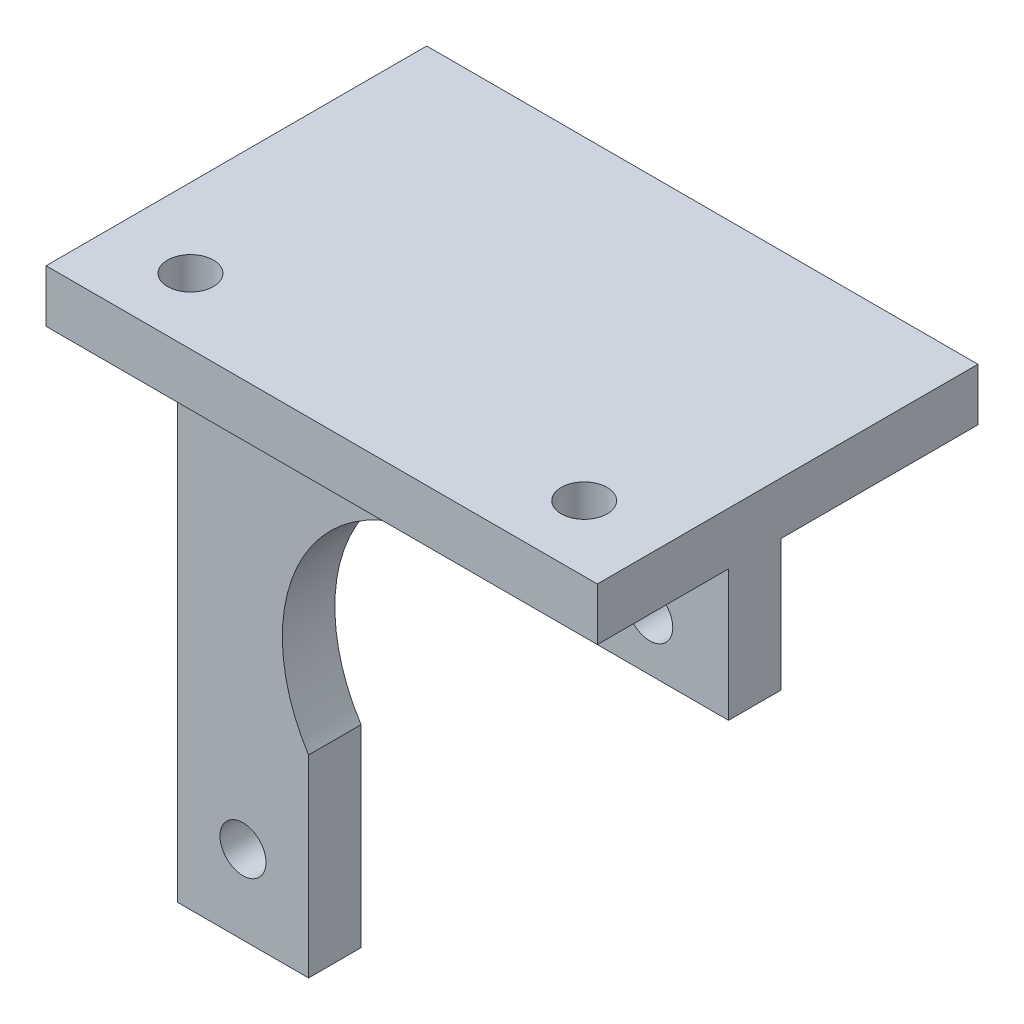
ISO-10303-21;
HEADER;
FILE_DESCRIPTION(('STEP AP214'),'2;1');
FILE_NAME('part.step','',(''),(''),'','','');
FILE_SCHEMA(('AUTOMOTIVE_DESIGN { 1 0 10303 214 1 1 1 1 }'));
ENDSEC;
DATA;
#1=APPLICATION_CONTEXT('core data for automotive mechanical design processes');
#2=APPLICATION_PROTOCOL_DEFINITION('international standard','automotive_design',2000,#1);
#3=PRODUCT_CONTEXT('',#1,'mechanical');
#4=PRODUCT('Part','Part','',(#3));
#5=PRODUCT_RELATED_PRODUCT_CATEGORY('part','',(#4));
#6=PRODUCT_DEFINITION_FORMATION('','',#4);
#7=PRODUCT_DEFINITION_CONTEXT('part definition',#1,'design');
#8=PRODUCT_DEFINITION('design','',#6,#7);
#9=PRODUCT_DEFINITION_SHAPE('','',#8);
#10=(LENGTH_UNIT() NAMED_UNIT(*) SI_UNIT(.MILLI.,.METRE.));
#11=(NAMED_UNIT(*) PLANE_ANGLE_UNIT() SI_UNIT($,.RADIAN.));
#12=(NAMED_UNIT(*) SI_UNIT($,.STERADIAN.) SOLID_ANGLE_UNIT());
#13=UNCERTAINTY_MEASURE_WITH_UNIT(LENGTH_MEASURE(1.E-05),#10,'distance_accuracy_value','');
#14=(GEOMETRIC_REPRESENTATION_CONTEXT(3) GLOBAL_UNCERTAINTY_ASSIGNED_CONTEXT((#13)) GLOBAL_UNIT_ASSIGNED_CONTEXT((#10,
#11,#12)) REPRESENTATION_CONTEXT('',''));
#15=CARTESIAN_POINT('',(0.,0.,0.));
#16=DIRECTION('',(0.,0.,1.));
#17=DIRECTION('',(1.,0.,0.));
#18=AXIS2_PLACEMENT_3D('',#15,#16,#17);
#19=CARTESIAN_POINT('',(0.,0.,4.));
#20=DIRECTION('',(0.,0.,1.));
#21=DIRECTION('',(1.,0.,0.));
#22=AXIS2_PLACEMENT_3D('',#19,#20,#21);
#23=PLANE('',#22);
#24=CARTESIAN_POINT('',(15.5,15.5,4.));
#25=DIRECTION('',(0.,0.,1.));
#26=DIRECTION('',(1.,0.,0.));
#27=AXIS2_PLACEMENT_3D('',#24,#25,#26);
#28=CIRCLE('',#27,1.75);
#29=CARTESIAN_POINT('',(17.25,15.5,4.));
#30=VERTEX_POINT('',#29);
#31=EDGE_CURVE('E198',#30,#30,#28,.T.);
#32=ORIENTED_EDGE('',*,*,#31,.F.);
#33=EDGE_LOOP('',(#32));
#34=FACE_BOUND('',#33,.T.);
#35=CARTESIAN_POINT('',(0.,0.,4.));
#36=DIRECTION('',(0.,0.,-1.));
#37=DIRECTION('',(1.,0.,0.));
#38=AXIS2_PLACEMENT_3D('',#35,#36,#37);
#39=CIRCLE('',#38,12.5);
#40=CARTESIAN_POINT('',(-10.5,-6.78232998312527,4.));
#41=VERTEX_POINT('',#40);
#42=CARTESIAN_POINT('',(4.89897948556636,11.5,4.));
#43=VERTEX_POINT('',#42);
#44=EDGE_CURVE('E134',#41,#43,#39,.T.);
#45=ORIENTED_EDGE('',*,*,#44,.T.);
#46=DIRECTION('',(1.,0.,0.));
#47=VECTOR('',#46,1.);
#48=CARTESIAN_POINT('',(21.5,11.5,4.));
#49=LINE('',#48,#47);
#50=CARTESIAN_POINT('',(21.5,11.5,4.));
#51=VERTEX_POINT('',#50);
#52=EDGE_CURVE('E85',#43,#51,#49,.T.);
#53=ORIENTED_EDGE('',*,*,#52,.T.);
#54=DIRECTION('',(0.,1.,0.));
#55=VECTOR('',#54,1.);
#56=CARTESIAN_POINT('',(21.5,21.5,4.));
#57=LINE('',#56,#55);
#58=CARTESIAN_POINT('',(21.5,21.5,3.99999999999999));
#59=VERTEX_POINT('',#58);
#60=EDGE_CURVE('E144',#51,#59,#57,.T.);
#61=ORIENTED_EDGE('',*,*,#60,.T.);
#62=DIRECTION('',(-1.,0.,0.));
#63=VECTOR('',#62,1.);
#64=CARTESIAN_POINT('',(-20.5,21.5,4.));
#65=LINE('',#64,#63);
#66=CARTESIAN_POINT('',(-20.5,21.5,4.));
#67=VERTEX_POINT('',#66);
#68=EDGE_CURVE('E102',#59,#67,#65,.T.);
#69=ORIENTED_EDGE('',*,*,#68,.T.);
#70=DIRECTION('',(0.,-1.,0.));
#71=VECTOR('',#70,1.);
#72=CARTESIAN_POINT('',(-20.5,-21.5,4.));
#73=LINE('',#72,#71);
#74=CARTESIAN_POINT('',(-20.5,-21.5,4.));
#75=VERTEX_POINT('',#74);
#76=EDGE_CURVE('E95',#67,#75,#73,.T.);
#77=ORIENTED_EDGE('',*,*,#76,.T.);
#78=DIRECTION('',(1.,0.,0.));
#79=VECTOR('',#78,1.);
#80=CARTESIAN_POINT('',(-10.5,-21.5,4.));
#81=LINE('',#80,#79);
#82=CARTESIAN_POINT('',(-10.5,-21.5,4.));
#83=VERTEX_POINT('',#82);
#84=EDGE_CURVE('E99',#75,#83,#81,.T.);
#85=ORIENTED_EDGE('',*,*,#84,.T.);
#86=DIRECTION('',(0.,1.,0.));
#87=VECTOR('',#86,1.);
#88=CARTESIAN_POINT('',(-10.5,-6.78232998312527,4.));
#89=LINE('',#88,#87);
#90=EDGE_CURVE('E50',#83,#41,#89,.T.);
#91=ORIENTED_EDGE('',*,*,#90,.T.);
#92=EDGE_LOOP('',(#45,#53,#61,#69,#77,#85,#91));
#93=FACE_BOUND('',#92,.T.);
#94=CARTESIAN_POINT('',(-15.5,15.5,4.));
#95=DIRECTION('',(0.,0.,1.));
#96=DIRECTION('',(1.,0.,0.));
#97=AXIS2_PLACEMENT_3D('',#94,#95,#96);
#98=CIRCLE('',#97,1.75);
#99=CARTESIAN_POINT('',(-13.75,15.5,4.));
#100=VERTEX_POINT('',#99);
#101=EDGE_CURVE('E123',#100,#100,#98,.T.);
#102=ORIENTED_EDGE('',*,*,#101,.F.);
#103=EDGE_LOOP('',(#102));
#104=FACE_BOUND('',#103,.T.);
#105=CARTESIAN_POINT('',(-15.5,-15.5,4.));
#106=DIRECTION('',(0.,0.,1.));
#107=DIRECTION('',(1.,0.,0.));
#108=AXIS2_PLACEMENT_3D('',#105,#106,#107);
#109=CIRCLE('',#108,1.75);
#110=CARTESIAN_POINT('',(-13.75,-15.5,4.));
#111=VERTEX_POINT('',#110);
#112=EDGE_CURVE('E192',#111,#111,#109,.T.);
#113=ORIENTED_EDGE('',*,*,#112,.F.);
#114=EDGE_LOOP('',(#113));
#115=FACE_BOUND('',#114,.T.);
#116=ADVANCED_FACE('F33',(#34,#93,#104,#115),#23,.T.);
#117=CARTESIAN_POINT('',(0.,0.,0.));
#118=DIRECTION('',(0.,0.,1.));
#119=DIRECTION('',(1.,0.,0.));
#120=AXIS2_PLACEMENT_3D('',#117,#118,#119);
#121=PLANE('',#120);
#122=CARTESIAN_POINT('',(0.,0.,0.));
#123=DIRECTION('',(0.,0.,-1.));
#124=DIRECTION('',(1.,0.,0.));
#125=AXIS2_PLACEMENT_3D('',#122,#123,#124);
#126=CIRCLE('',#125,12.5);
#127=CARTESIAN_POINT('',(-10.5,-6.78232998312527,0.));
#128=VERTEX_POINT('',#127);
#129=CARTESIAN_POINT('',(4.89897948556636,11.5,0.));
#130=VERTEX_POINT('',#129);
#131=EDGE_CURVE('E119',#128,#130,#126,.T.);
#132=ORIENTED_EDGE('',*,*,#131,.F.);
#133=DIRECTION('',(0.,1.,0.));
#134=VECTOR('',#133,1.);
#135=CARTESIAN_POINT('',(-10.5,-6.78232998312527,0.));
#136=LINE('',#135,#134);
#137=CARTESIAN_POINT('',(-10.5,-21.5,0.));
#138=VERTEX_POINT('',#137);
#139=EDGE_CURVE('E77',#138,#128,#136,.T.);
#140=ORIENTED_EDGE('',*,*,#139,.F.);
#141=DIRECTION('',(1.,0.,0.));
#142=VECTOR('',#141,1.);
#143=CARTESIAN_POINT('',(-10.5,-21.5,0.));
#144=LINE('',#143,#142);
#145=CARTESIAN_POINT('',(-20.5,-21.5,0.));
#146=VERTEX_POINT('',#145);
#147=EDGE_CURVE('E71',#146,#138,#144,.T.);
#148=ORIENTED_EDGE('',*,*,#147,.F.);
#149=DIRECTION('',(0.,-1.,0.));
#150=VECTOR('',#149,1.);
#151=CARTESIAN_POINT('',(-20.5,-21.5,0.));
#152=LINE('',#151,#150);
#153=CARTESIAN_POINT('',(-20.5,21.5,0.));
#154=VERTEX_POINT('',#153);
#155=EDGE_CURVE('E110',#154,#146,#152,.T.);
#156=ORIENTED_EDGE('',*,*,#155,.F.);
#157=DIRECTION('',(-1.,0.,0.));
#158=VECTOR('',#157,1.);
#159=CARTESIAN_POINT('',(-20.5,21.5,0.));
#160=LINE('',#159,#158);
#161=CARTESIAN_POINT('',(21.5,21.5,0.));
#162=VERTEX_POINT('',#161);
#163=EDGE_CURVE('E128',#162,#154,#160,.T.);
#164=ORIENTED_EDGE('',*,*,#163,.F.);
#165=DIRECTION('',(0.,1.,0.));
#166=VECTOR('',#165,1.);
#167=CARTESIAN_POINT('',(21.5,21.5,0.));
#168=LINE('',#167,#166);
#169=CARTESIAN_POINT('',(21.5,11.5,0.));
#170=VERTEX_POINT('',#169);
#171=EDGE_CURVE('E125',#170,#162,#168,.T.);
#172=ORIENTED_EDGE('',*,*,#171,.F.);
#173=DIRECTION('',(1.,0.,0.));
#174=VECTOR('',#173,1.);
#175=CARTESIAN_POINT('',(21.5,11.5,0.));
#176=LINE('',#175,#174);
#177=EDGE_CURVE('E122',#130,#170,#176,.T.);
#178=ORIENTED_EDGE('',*,*,#177,.F.);
#179=EDGE_LOOP('',(#132,#140,#148,#156,#164,#172,#178));
#180=FACE_BOUND('',#179,.T.);
#181=CARTESIAN_POINT('',(-15.5,15.5,0.));
#182=DIRECTION('',(0.,0.,1.));
#183=DIRECTION('',(1.,0.,0.));
#184=AXIS2_PLACEMENT_3D('',#181,#182,#183);
#185=CIRCLE('',#184,1.75);
#186=CARTESIAN_POINT('',(-13.75,15.5,0.));
#187=VERTEX_POINT('',#186);
#188=EDGE_CURVE('E201',#187,#187,#185,.T.);
#189=ORIENTED_EDGE('',*,*,#188,.T.);
#190=EDGE_LOOP('',(#189));
#191=FACE_BOUND('',#190,.T.);
#192=CARTESIAN_POINT('',(15.5,15.5,0.));
#193=DIRECTION('',(0.,0.,1.));
#194=DIRECTION('',(1.,0.,0.));
#195=AXIS2_PLACEMENT_3D('',#192,#193,#194);
#196=CIRCLE('',#195,1.75);
#197=CARTESIAN_POINT('',(17.25,15.5,0.));
#198=VERTEX_POINT('',#197);
#199=EDGE_CURVE('E195',#198,#198,#196,.T.);
#200=ORIENTED_EDGE('',*,*,#199,.T.);
#201=EDGE_LOOP('',(#200));
#202=FACE_BOUND('',#201,.T.);
#203=CARTESIAN_POINT('',(-15.5,-15.5,0.));
#204=DIRECTION('',(0.,0.,1.));
#205=DIRECTION('',(1.,0.,0.));
#206=AXIS2_PLACEMENT_3D('',#203,#204,#205);
#207=CIRCLE('',#206,1.75);
#208=CARTESIAN_POINT('',(-13.75,-15.5,0.));
#209=VERTEX_POINT('',#208);
#210=EDGE_CURVE('E191',#209,#209,#207,.T.);
#211=ORIENTED_EDGE('',*,*,#210,.T.);
#212=EDGE_LOOP('',(#211));
#213=FACE_BOUND('',#212,.T.);
#214=ADVANCED_FACE('F147',(#180,#191,#202,#213),#121,.F.);
#215=CARTESIAN_POINT('',(0.,0.,4.));
#216=DIRECTION('',(0.,0.,-1.));
#217=DIRECTION('',(-1.,0.,0.));
#218=AXIS2_PLACEMENT_3D('',#215,#216,#217);
#219=CYLINDRICAL_SURFACE('',#218,12.5);
#220=ORIENTED_EDGE('',*,*,#131,.T.);
#221=DIRECTION('',(0.,0.,-1.));
#222=VECTOR('',#221,1.);
#223=CARTESIAN_POINT('',(4.89897948556636,11.5,4.));
#224=LINE('',#223,#222);
#225=EDGE_CURVE('E11',#43,#130,#224,.T.);
#226=ORIENTED_EDGE('',*,*,#225,.F.);
#227=ORIENTED_EDGE('',*,*,#44,.F.);
#228=DIRECTION('',(0.,0.,-1.));
#229=VECTOR('',#228,1.);
#230=CARTESIAN_POINT('',(-10.5,-6.78232998312527,4.));
#231=LINE('',#230,#229);
#232=EDGE_CURVE('E115',#41,#128,#231,.T.);
#233=ORIENTED_EDGE('',*,*,#232,.T.);
#234=EDGE_LOOP('',(#220,#226,#227,#233));
#235=FACE_BOUND('',#234,.T.);
#236=ADVANCED_FACE('F35',(#235),#219,.F.);
#237=CARTESIAN_POINT('',(21.5,11.5,4.));
#238=DIRECTION('',(0.,1.,0.));
#239=DIRECTION('',(-1.,0.,0.));
#240=AXIS2_PLACEMENT_3D('',#237,#238,#239);
#241=PLANE('',#240);
#242=ORIENTED_EDGE('',*,*,#177,.T.);
#243=DIRECTION('',(0.,0.,-1.));
#244=VECTOR('',#243,1.);
#245=CARTESIAN_POINT('',(21.5,11.5,4.));
#246=LINE('',#245,#244);
#247=EDGE_CURVE('E42',#51,#170,#246,.T.);
#248=ORIENTED_EDGE('',*,*,#247,.F.);
#249=ORIENTED_EDGE('',*,*,#52,.F.);
#250=ORIENTED_EDGE('',*,*,#225,.T.);
#251=EDGE_LOOP('',(#242,#248,#249,#250));
#252=FACE_BOUND('',#251,.T.);
#253=ADVANCED_FACE('F294',(#252),#241,.F.);
#254=CARTESIAN_POINT('',(21.5,21.5,4.));
#255=DIRECTION('',(-1.,0.,0.));
#256=DIRECTION('',(0.,-1.,0.));
#257=AXIS2_PLACEMENT_3D('',#254,#255,#256);
#258=PLANE('',#257);
#259=ORIENTED_EDGE('',*,*,#171,.T.);
#260=DIRECTION('',(0.,0.,-1.));
#261=VECTOR('',#260,1.);
#262=CARTESIAN_POINT('',(21.5,21.5,-15.));
#263=LINE('',#262,#261);
#264=CARTESIAN_POINT('',(21.5,21.5,-15.));
#265=VERTEX_POINT('',#264);
#266=EDGE_CURVE('E158',#162,#265,#263,.T.);
#267=ORIENTED_EDGE('',*,*,#266,.T.);
#268=DIRECTION('',(0.,-1.,0.));
#269=VECTOR('',#268,1.);
#270=CARTESIAN_POINT('',(21.5,25.5,-15.));
#271=LINE('',#270,#269);
#272=CARTESIAN_POINT('',(21.5,25.5,-15.));
#273=VERTEX_POINT('',#272);
#274=EDGE_CURVE('E182',#273,#265,#271,.T.);
#275=ORIENTED_EDGE('',*,*,#274,.F.);
#276=DIRECTION('',(0.,0.,-1.));
#277=VECTOR('',#276,1.);
#278=CARTESIAN_POINT('',(21.5,25.5,-15.));
#279=LINE('',#278,#277);
#280=CARTESIAN_POINT('',(21.5,25.5,14.));
#281=VERTEX_POINT('',#280);
#282=EDGE_CURVE('E238',#281,#273,#279,.T.);
#283=ORIENTED_EDGE('',*,*,#282,.F.);
#284=DIRECTION('',(0.,-1.,0.));
#285=VECTOR('',#284,1.);
#286=CARTESIAN_POINT('',(21.5,25.5,14.));
#287=LINE('',#286,#285);
#288=CARTESIAN_POINT('',(21.5,21.5,14.));
#289=VERTEX_POINT('',#288);
#290=EDGE_CURVE('E185',#281,#289,#287,.T.);
#291=ORIENTED_EDGE('',*,*,#290,.T.);
#292=EDGE_CURVE('E175',#289,#59,#263,.T.);
#293=ORIENTED_EDGE('',*,*,#292,.T.);
#294=ORIENTED_EDGE('',*,*,#60,.F.);
#295=ORIENTED_EDGE('',*,*,#247,.T.);
#296=EDGE_LOOP('',(#259,#267,#275,#283,#291,#293,#294,#295));
#297=FACE_BOUND('',#296,.T.);
#298=ADVANCED_FACE('F140',(#297),#258,.F.);
#299=CARTESIAN_POINT('',(-20.5,-21.5,4.));
#300=DIRECTION('',(1.,0.,0.));
#301=DIRECTION('',(0.,1.,0.));
#302=AXIS2_PLACEMENT_3D('',#299,#300,#301);
#303=PLANE('',#302);
#304=ORIENTED_EDGE('',*,*,#155,.T.);
#305=DIRECTION('',(0.,0.,-1.));
#306=VECTOR('',#305,1.);
#307=CARTESIAN_POINT('',(-20.5,-21.5,4.));
#308=LINE('',#307,#306);
#309=EDGE_CURVE('E106',#75,#146,#308,.T.);
#310=ORIENTED_EDGE('',*,*,#309,.F.);
#311=ORIENTED_EDGE('',*,*,#76,.F.);
#312=DIRECTION('',(0.,0.,1.));
#313=VECTOR('',#312,1.);
#314=CARTESIAN_POINT('',(-20.5,21.5,-15.));
#315=LINE('',#314,#313);
#316=CARTESIAN_POINT('',(-20.5,21.5,14.));
#317=VERTEX_POINT('',#316);
#318=EDGE_CURVE('E166',#67,#317,#315,.T.);
#319=ORIENTED_EDGE('',*,*,#318,.T.);
#320=DIRECTION('',(0.,-1.,0.));
#321=VECTOR('',#320,1.);
#322=CARTESIAN_POINT('',(-20.5,25.5,14.));
#323=LINE('',#322,#321);
#324=CARTESIAN_POINT('',(-20.5,25.5,14.));
#325=VERTEX_POINT('',#324);
#326=EDGE_CURVE('E188',#325,#317,#323,.T.);
#327=ORIENTED_EDGE('',*,*,#326,.F.);
#328=DIRECTION('',(0.,0.,1.));
#329=VECTOR('',#328,1.);
#330=CARTESIAN_POINT('',(-20.5,25.5,-15.));
#331=LINE('',#330,#329);
#332=CARTESIAN_POINT('',(-20.5,25.5,-15.));
#333=VERTEX_POINT('',#332);
#334=EDGE_CURVE('E180',#333,#325,#331,.T.);
#335=ORIENTED_EDGE('',*,*,#334,.F.);
#336=DIRECTION('',(0.,-1.,0.));
#337=VECTOR('',#336,1.);
#338=CARTESIAN_POINT('',(-20.5,25.5,-15.));
#339=LINE('',#338,#337);
#340=CARTESIAN_POINT('',(-20.5,21.5,-15.));
#341=VERTEX_POINT('',#340);
#342=EDGE_CURVE('E164',#333,#341,#339,.T.);
#343=ORIENTED_EDGE('',*,*,#342,.T.);
#344=EDGE_CURVE('E157',#341,#154,#315,.T.);
#345=ORIENTED_EDGE('',*,*,#344,.T.);
#346=EDGE_LOOP('',(#304,#310,#311,#319,#327,#335,#343,#345));
#347=FACE_BOUND('',#346,.T.);
#348=ADVANCED_FACE('F107',(#347),#303,.F.);
#349=CARTESIAN_POINT('',(-10.5,-21.5,4.));
#350=DIRECTION('',(0.,1.,0.));
#351=DIRECTION('',(0.,0.,1.));
#352=AXIS2_PLACEMENT_3D('',#349,#350,#351);
#353=PLANE('',#352);
#354=ORIENTED_EDGE('',*,*,#147,.T.);
#355=DIRECTION('',(0.,0.,-1.));
#356=VECTOR('',#355,1.);
#357=CARTESIAN_POINT('',(-10.5,-21.5,4.));
#358=LINE('',#357,#356);
#359=EDGE_CURVE('E111',#83,#138,#358,.T.);
#360=ORIENTED_EDGE('',*,*,#359,.F.);
#361=ORIENTED_EDGE('',*,*,#84,.F.);
#362=ORIENTED_EDGE('',*,*,#309,.T.);
#363=EDGE_LOOP('',(#354,#360,#361,#362));
#364=FACE_BOUND('',#363,.T.);
#365=ADVANCED_FACE('F113',(#364),#353,.F.);
#366=CARTESIAN_POINT('',(-10.5,-6.78232998312527,4.));
#367=DIRECTION('',(-1.,0.,0.));
#368=DIRECTION('',(0.,-1.,0.));
#369=AXIS2_PLACEMENT_3D('',#366,#367,#368);
#370=PLANE('',#369);
#371=ORIENTED_EDGE('',*,*,#139,.T.);
#372=ORIENTED_EDGE('',*,*,#232,.F.);
#373=ORIENTED_EDGE('',*,*,#90,.F.);
#374=ORIENTED_EDGE('',*,*,#359,.T.);
#375=EDGE_LOOP('',(#371,#372,#373,#374));
#376=FACE_BOUND('',#375,.T.);
#377=ADVANCED_FACE('F286',(#376),#370,.F.);
#378=CARTESIAN_POINT('',(-15.5,15.5,4.));
#379=DIRECTION('',(0.,0.,-1.));
#380=DIRECTION('',(-1.,0.,0.));
#381=AXIS2_PLACEMENT_3D('',#378,#379,#380);
#382=CYLINDRICAL_SURFACE('',#381,1.75);
#383=ORIENTED_EDGE('',*,*,#101,.T.);
#384=EDGE_LOOP('',(#383));
#385=FACE_BOUND('',#384,.T.);
#386=ORIENTED_EDGE('',*,*,#188,.F.);
#387=EDGE_LOOP('',(#386));
#388=FACE_BOUND('',#387,.T.);
#389=ADVANCED_FACE('F283',(#385,#388),#382,.F.);
#390=CARTESIAN_POINT('',(15.5,15.5,4.));
#391=DIRECTION('',(0.,0.,-1.));
#392=DIRECTION('',(-1.,0.,0.));
#393=AXIS2_PLACEMENT_3D('',#390,#391,#392);
#394=CYLINDRICAL_SURFACE('',#393,1.75);
#395=ORIENTED_EDGE('',*,*,#31,.T.);
#396=EDGE_LOOP('',(#395));
#397=FACE_BOUND('',#396,.T.);
#398=ORIENTED_EDGE('',*,*,#199,.F.);
#399=EDGE_LOOP('',(#398));
#400=FACE_BOUND('',#399,.T.);
#401=ADVANCED_FACE('F387',(#397,#400),#394,.F.);
#402=CARTESIAN_POINT('',(-15.5,-15.5,4.));
#403=DIRECTION('',(0.,0.,-1.));
#404=DIRECTION('',(-1.,0.,0.));
#405=AXIS2_PLACEMENT_3D('',#402,#403,#404);
#406=CYLINDRICAL_SURFACE('',#405,1.75);
#407=ORIENTED_EDGE('',*,*,#112,.T.);
#408=EDGE_LOOP('',(#407));
#409=FACE_BOUND('',#408,.T.);
#410=ORIENTED_EDGE('',*,*,#210,.F.);
#411=EDGE_LOOP('',(#410));
#412=FACE_BOUND('',#411,.T.);
#413=ADVANCED_FACE('F271',(#409,#412),#406,.F.);
#414=CARTESIAN_POINT('',(0.,21.5,0.));
#415=DIRECTION('',(0.,1.,0.));
#416=DIRECTION('',(0.,0.,1.));
#417=AXIS2_PLACEMENT_3D('',#414,#415,#416);
#418=PLANE('',#417);
#419=ORIENTED_EDGE('',*,*,#266,.F.);
#420=ORIENTED_EDGE('',*,*,#163,.T.);
#421=ORIENTED_EDGE('',*,*,#344,.F.);
#422=DIRECTION('',(-1.,0.,0.));
#423=VECTOR('',#422,1.);
#424=CARTESIAN_POINT('',(-20.5,21.5,-15.));
#425=LINE('',#424,#423);
#426=EDGE_CURVE('E177',#265,#341,#425,.T.);
#427=ORIENTED_EDGE('',*,*,#426,.F.);
#428=EDGE_LOOP('',(#419,#420,#421,#427));
#429=FACE_BOUND('',#428,.T.);
#430=ADVANCED_FACE('F154',(#429),#418,.F.);
#431=CARTESIAN_POINT('',(0.,25.5,0.));
#432=DIRECTION('',(0.,1.,0.));
#433=DIRECTION('',(0.,0.,1.));
#434=AXIS2_PLACEMENT_3D('',#431,#432,#433);
#435=PLANE('',#434);
#436=CARTESIAN_POINT('',(-14.5,25.5,9.));
#437=DIRECTION('',(0.,1.,0.));
#438=DIRECTION('',(0.,0.,1.));
#439=AXIS2_PLACEMENT_3D('',#436,#437,#438);
#440=CIRCLE('',#439,1.75);
#441=CARTESIAN_POINT('',(-14.5,25.5,10.75));
#442=VERTEX_POINT('',#441);
#443=EDGE_CURVE('E170',#442,#442,#440,.T.);
#444=ORIENTED_EDGE('',*,*,#443,.F.);
#445=EDGE_LOOP('',(#444));
#446=FACE_BOUND('',#445,.T.);
#447=ORIENTED_EDGE('',*,*,#334,.T.);
#448=DIRECTION('',(1.,0.,0.));
#449=VECTOR('',#448,1.);
#450=CARTESIAN_POINT('',(-20.5,25.5,14.));
#451=LINE('',#450,#449);
#452=EDGE_CURVE('E232',#325,#281,#451,.T.);
#453=ORIENTED_EDGE('',*,*,#452,.T.);
#454=ORIENTED_EDGE('',*,*,#282,.T.);
#455=DIRECTION('',(-1.,0.,0.));
#456=VECTOR('',#455,1.);
#457=CARTESIAN_POINT('',(-20.5,25.5,-15.));
#458=LINE('',#457,#456);
#459=EDGE_CURVE('E172',#273,#333,#458,.T.);
#460=ORIENTED_EDGE('',*,*,#459,.T.);
#461=EDGE_LOOP('',(#447,#453,#454,#460));
#462=FACE_BOUND('',#461,.T.);
#463=CARTESIAN_POINT('',(15.5,25.5,9.));
#464=DIRECTION('',(0.,1.,0.));
#465=DIRECTION('',(0.,0.,1.));
#466=AXIS2_PLACEMENT_3D('',#463,#464,#465);
#467=CIRCLE('',#466,1.75);
#468=CARTESIAN_POINT('',(15.5,25.5,10.75));
#469=VERTEX_POINT('',#468);
#470=EDGE_CURVE('E252',#469,#469,#467,.T.);
#471=ORIENTED_EDGE('',*,*,#470,.F.);
#472=EDGE_LOOP('',(#471));
#473=FACE_BOUND('',#472,.T.);
#474=ADVANCED_FACE('F240',(#446,#462,#473),#435,.T.);
#475=ORIENTED_EDGE('',*,*,#68,.F.);
#476=ORIENTED_EDGE('',*,*,#292,.F.);
#477=DIRECTION('',(1.,0.,0.));
#478=VECTOR('',#477,1.);
#479=CARTESIAN_POINT('',(-20.5,21.5,14.));
#480=LINE('',#479,#478);
#481=EDGE_CURVE('E165',#317,#289,#480,.T.);
#482=ORIENTED_EDGE('',*,*,#481,.F.);
#483=ORIENTED_EDGE('',*,*,#318,.F.);
#484=EDGE_LOOP('',(#475,#476,#482,#483));
#485=FACE_BOUND('',#484,.T.);
#486=CARTESIAN_POINT('',(-14.5,21.5,9.));
#487=DIRECTION('',(0.,1.,0.));
#488=DIRECTION('',(0.,0.,1.));
#489=AXIS2_PLACEMENT_3D('',#486,#487,#488);
#490=CIRCLE('',#489,1.75);
#491=CARTESIAN_POINT('',(-14.5,21.5,10.75));
#492=VERTEX_POINT('',#491);
#493=EDGE_CURVE('E249',#492,#492,#490,.T.);
#494=ORIENTED_EDGE('',*,*,#493,.T.);
#495=EDGE_LOOP('',(#494));
#496=FACE_BOUND('',#495,.T.);
#497=CARTESIAN_POINT('',(15.5,21.5,9.));
#498=DIRECTION('',(0.,1.,0.));
#499=DIRECTION('',(0.,0.,1.));
#500=AXIS2_PLACEMENT_3D('',#497,#498,#499);
#501=CIRCLE('',#500,1.75);
#502=CARTESIAN_POINT('',(15.5,21.5,10.75));
#503=VERTEX_POINT('',#502);
#504=EDGE_CURVE('E255',#503,#503,#501,.T.);
#505=ORIENTED_EDGE('',*,*,#504,.T.);
#506=EDGE_LOOP('',(#505));
#507=FACE_BOUND('',#506,.T.);
#508=ADVANCED_FACE('F245',(#485,#496,#507),#418,.F.);
#509=CARTESIAN_POINT('',(-20.5,25.5,14.));
#510=DIRECTION('',(0.,0.,-1.));
#511=DIRECTION('',(-1.,0.,0.));
#512=AXIS2_PLACEMENT_3D('',#509,#510,#511);
#513=PLANE('',#512);
#514=ORIENTED_EDGE('',*,*,#481,.T.);
#515=ORIENTED_EDGE('',*,*,#290,.F.);
#516=ORIENTED_EDGE('',*,*,#452,.F.);
#517=ORIENTED_EDGE('',*,*,#326,.T.);
#518=EDGE_LOOP('',(#514,#515,#516,#517));
#519=FACE_BOUND('',#518,.T.);
#520=ADVANCED_FACE('F234',(#519),#513,.F.);
#521=CARTESIAN_POINT('',(-20.5,25.5,-15.));
#522=DIRECTION('',(0.,0.,1.));
#523=DIRECTION('',(1.,0.,0.));
#524=AXIS2_PLACEMENT_3D('',#521,#522,#523);
#525=PLANE('',#524);
#526=ORIENTED_EDGE('',*,*,#426,.T.);
#527=ORIENTED_EDGE('',*,*,#342,.F.);
#528=ORIENTED_EDGE('',*,*,#459,.F.);
#529=ORIENTED_EDGE('',*,*,#274,.T.);
#530=EDGE_LOOP('',(#526,#527,#528,#529));
#531=FACE_BOUND('',#530,.T.);
#532=ADVANCED_FACE('F352',(#531),#525,.F.);
#533=CARTESIAN_POINT('',(-14.5,25.5,9.));
#534=DIRECTION('',(0.,-1.,0.));
#535=DIRECTION('',(0.,0.,-1.));
#536=AXIS2_PLACEMENT_3D('',#533,#534,#535);
#537=CYLINDRICAL_SURFACE('',#536,1.75);
#538=ORIENTED_EDGE('',*,*,#443,.T.);
#539=EDGE_LOOP('',(#538));
#540=FACE_BOUND('',#539,.T.);
#541=ORIENTED_EDGE('',*,*,#493,.F.);
#542=EDGE_LOOP('',(#541));
#543=FACE_BOUND('',#542,.T.);
#544=ADVANCED_FACE('F361',(#540,#543),#537,.F.);
#545=CARTESIAN_POINT('',(15.5,25.5,9.));
#546=DIRECTION('',(0.,-1.,0.));
#547=DIRECTION('',(0.,0.,-1.));
#548=AXIS2_PLACEMENT_3D('',#545,#546,#547);
#549=CYLINDRICAL_SURFACE('',#548,1.75);
#550=ORIENTED_EDGE('',*,*,#470,.T.);
#551=EDGE_LOOP('',(#550));
#552=FACE_BOUND('',#551,.T.);
#553=ORIENTED_EDGE('',*,*,#504,.F.);
#554=EDGE_LOOP('',(#553));
#555=FACE_BOUND('',#554,.T.);
#556=ADVANCED_FACE('F261',(#552,#555),#549,.F.);
#557=CLOSED_SHELL('',(#116,#214,#236,#253,#298,#348,#365,#377,#389,#401,#413,#430,#474,#508,
#520,#532,#544,#556));
#558=MANIFOLD_SOLID_BREP('B2',#557);
#559=ADVANCED_BREP_SHAPE_REPRESENTATION('',(#18,#558),#14);
#560=SHAPE_DEFINITION_REPRESENTATION(#9,#559);
ENDSEC;
END-ISO-10303-21;
